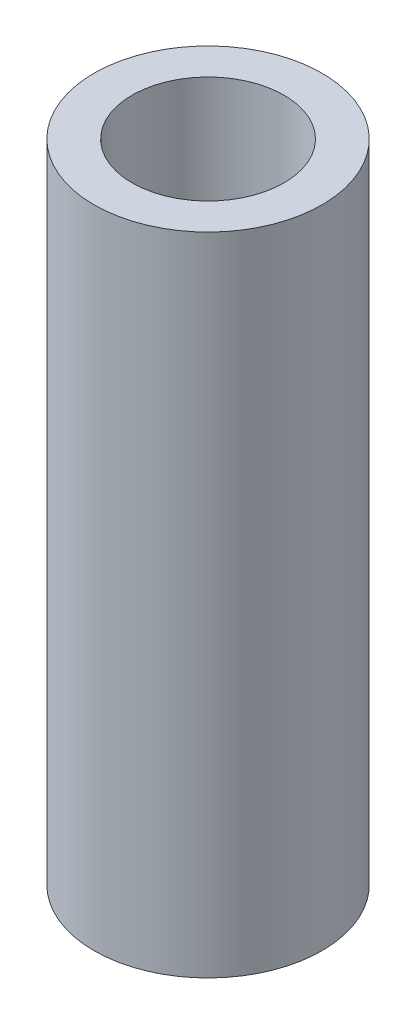
ISO-10303-21;
HEADER;
FILE_DESCRIPTION(('STEP AP214'),'2;1');
FILE_NAME('part.step','',(''),(''),'','','');
FILE_SCHEMA(('AUTOMOTIVE_DESIGN { 1 0 10303 214 1 1 1 1 }'));
ENDSEC;
DATA;
#1=APPLICATION_CONTEXT('core data for automotive mechanical design processes');
#2=APPLICATION_PROTOCOL_DEFINITION('international standard','automotive_design',2000,#1);
#3=PRODUCT_CONTEXT('',#1,'mechanical');
#4=PRODUCT('Part','Part','',(#3));
#5=PRODUCT_RELATED_PRODUCT_CATEGORY('part','',(#4));
#6=PRODUCT_DEFINITION_FORMATION('','',#4);
#7=PRODUCT_DEFINITION_CONTEXT('part definition',#1,'design');
#8=PRODUCT_DEFINITION('design','',#6,#7);
#9=PRODUCT_DEFINITION_SHAPE('','',#8);
#10=(LENGTH_UNIT() NAMED_UNIT(*) SI_UNIT(.MILLI.,.METRE.));
#11=(NAMED_UNIT(*) PLANE_ANGLE_UNIT() SI_UNIT($,.RADIAN.));
#12=(NAMED_UNIT(*) SI_UNIT($,.STERADIAN.) SOLID_ANGLE_UNIT());
#13=UNCERTAINTY_MEASURE_WITH_UNIT(LENGTH_MEASURE(1.E-05),#10,'distance_accuracy_value','');
#14=(GEOMETRIC_REPRESENTATION_CONTEXT(3) GLOBAL_UNCERTAINTY_ASSIGNED_CONTEXT((#13)) GLOBAL_UNIT_ASSIGNED_CONTEXT((#10,
#11,#12)) REPRESENTATION_CONTEXT('',''));
#15=CARTESIAN_POINT('',(0.,0.,0.));
#16=DIRECTION('',(0.,0.,1.));
#17=DIRECTION('',(1.,0.,0.));
#18=AXIS2_PLACEMENT_3D('',#15,#16,#17);
#19=CARTESIAN_POINT('',(0.,42.5,0.));
#20=DIRECTION('',(0.,1.,0.));
#21=DIRECTION('',(0.,0.,1.));
#22=AXIS2_PLACEMENT_3D('',#19,#20,#21);
#23=PLANE('',#22);
#24=CARTESIAN_POINT('',(0.,42.5,0.));
#25=DIRECTION('',(0.,1.,0.));
#26=DIRECTION('',(0.,0.,1.));
#27=AXIS2_PLACEMENT_3D('',#24,#25,#26);
#28=CIRCLE('',#27,7.5);
#29=CARTESIAN_POINT('',(0.,42.5,7.5));
#30=VERTEX_POINT('',#29);
#31=EDGE_CURVE('E10',#30,#30,#28,.T.);
#32=ORIENTED_EDGE('',*,*,#31,.T.);
#33=EDGE_LOOP('',(#32));
#34=FACE_BOUND('',#33,.T.);
#35=CARTESIAN_POINT('',(0.,42.5,0.));
#36=DIRECTION('',(0.,1.,0.));
#37=DIRECTION('',(0.,0.,1.));
#38=AXIS2_PLACEMENT_3D('',#35,#36,#37);
#39=CIRCLE('',#38,5.);
#40=CARTESIAN_POINT('',(0.,42.5,5.));
#41=VERTEX_POINT('',#40);
#42=EDGE_CURVE('E50',#41,#41,#39,.T.);
#43=ORIENTED_EDGE('',*,*,#42,.F.);
#44=EDGE_LOOP('',(#43));
#45=FACE_BOUND('',#44,.T.);
#46=ADVANCED_FACE('F37',(#34,#45),#23,.T.);
#47=CARTESIAN_POINT('',(0.,0.,0.));
#48=DIRECTION('',(0.,1.,0.));
#49=DIRECTION('',(0.,0.,1.));
#50=AXIS2_PLACEMENT_3D('',#47,#48,#49);
#51=PLANE('',#50);
#52=CARTESIAN_POINT('',(0.,0.,0.));
#53=DIRECTION('',(0.,1.,0.));
#54=DIRECTION('',(0.,0.,1.));
#55=AXIS2_PLACEMENT_3D('',#52,#53,#54);
#56=CIRCLE('',#55,7.5);
#57=CARTESIAN_POINT('',(0.,0.,7.5));
#58=VERTEX_POINT('',#57);
#59=EDGE_CURVE('E41',#58,#58,#56,.T.);
#60=ORIENTED_EDGE('',*,*,#59,.F.);
#61=EDGE_LOOP('',(#60));
#62=FACE_BOUND('',#61,.T.);
#63=CARTESIAN_POINT('',(0.,0.,0.));
#64=DIRECTION('',(0.,1.,0.));
#65=DIRECTION('',(0.,0.,1.));
#66=AXIS2_PLACEMENT_3D('',#63,#64,#65);
#67=CIRCLE('',#66,5.);
#68=CARTESIAN_POINT('',(0.,0.,5.));
#69=VERTEX_POINT('',#68);
#70=EDGE_CURVE('E52',#69,#69,#67,.T.);
#71=ORIENTED_EDGE('',*,*,#70,.T.);
#72=EDGE_LOOP('',(#71));
#73=FACE_BOUND('',#72,.T.);
#74=ADVANCED_FACE('F64',(#62,#73),#51,.F.);
#75=CARTESIAN_POINT('',(0.,42.5,0.));
#76=DIRECTION('',(0.,-1.,0.));
#77=DIRECTION('',(0.,0.,-1.));
#78=AXIS2_PLACEMENT_3D('',#75,#76,#77);
#79=CYLINDRICAL_SURFACE('',#78,7.5);
#80=ORIENTED_EDGE('',*,*,#31,.F.);
#81=EDGE_LOOP('',(#80));
#82=FACE_BOUND('',#81,.T.);
#83=ORIENTED_EDGE('',*,*,#59,.T.);
#84=EDGE_LOOP('',(#83));
#85=FACE_BOUND('',#84,.T.);
#86=ADVANCED_FACE('F39',(#82,#85),#79,.T.);
#87=CARTESIAN_POINT('',(0.,42.5,0.));
#88=DIRECTION('',(0.,-1.,0.));
#89=DIRECTION('',(0.,0.,-1.));
#90=AXIS2_PLACEMENT_3D('',#87,#88,#89);
#91=CYLINDRICAL_SURFACE('',#90,5.);
#92=ORIENTED_EDGE('',*,*,#42,.T.);
#93=EDGE_LOOP('',(#92));
#94=FACE_BOUND('',#93,.T.);
#95=ORIENTED_EDGE('',*,*,#70,.F.);
#96=EDGE_LOOP('',(#95));
#97=FACE_BOUND('',#96,.T.);
#98=ADVANCED_FACE('F60',(#94,#97),#91,.F.);
#99=CLOSED_SHELL('',(#46,#74,#86,#98));
#100=MANIFOLD_SOLID_BREP('B2',#99);
#101=ADVANCED_BREP_SHAPE_REPRESENTATION('',(#18,#100),#14);
#102=SHAPE_DEFINITION_REPRESENTATION(#9,#101);
ENDSEC;
END-ISO-10303-21;
